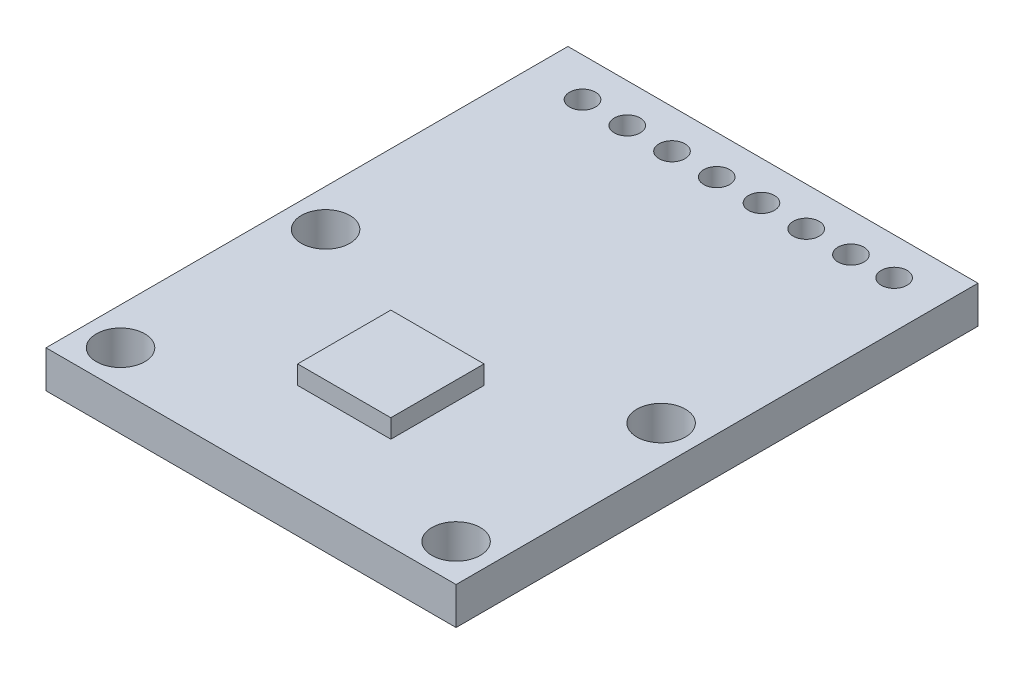
ISO-10303-21;
HEADER;
FILE_DESCRIPTION(('STEP AP214'),'2;1');
FILE_NAME('part.step','',(''),(''),'','','');
FILE_SCHEMA(('AUTOMOTIVE_DESIGN { 1 0 10303 214 1 1 1 1 }'));
ENDSEC;
DATA;
#1=APPLICATION_CONTEXT('core data for automotive mechanical design processes');
#2=APPLICATION_PROTOCOL_DEFINITION('international standard','automotive_design',2000,#1);
#3=PRODUCT_CONTEXT('',#1,'mechanical');
#4=PRODUCT('Part','Part','',(#3));
#5=PRODUCT_RELATED_PRODUCT_CATEGORY('part','',(#4));
#6=PRODUCT_DEFINITION_FORMATION('','',#4);
#7=PRODUCT_DEFINITION_CONTEXT('part definition',#1,'design');
#8=PRODUCT_DEFINITION('design','',#6,#7);
#9=PRODUCT_DEFINITION_SHAPE('','',#8);
#10=(LENGTH_UNIT() NAMED_UNIT(*) SI_UNIT(.MILLI.,.METRE.));
#11=(NAMED_UNIT(*) PLANE_ANGLE_UNIT() SI_UNIT($,.RADIAN.));
#12=(NAMED_UNIT(*) SI_UNIT($,.STERADIAN.) SOLID_ANGLE_UNIT());
#13=UNCERTAINTY_MEASURE_WITH_UNIT(LENGTH_MEASURE(1.E-05),#10,'distance_accuracy_value','');
#14=(GEOMETRIC_REPRESENTATION_CONTEXT(3) GLOBAL_UNCERTAINTY_ASSIGNED_CONTEXT((#13)) GLOBAL_UNIT_ASSIGNED_CONTEXT((#10,
#11,#12)) REPRESENTATION_CONTEXT('',''));
#15=CARTESIAN_POINT('',(0.,0.,0.));
#16=DIRECTION('',(0.,0.,1.));
#17=DIRECTION('',(1.,0.,0.));
#18=AXIS2_PLACEMENT_3D('',#15,#16,#17);
#19=CARTESIAN_POINT('',(0.,2.,0.));
#20=DIRECTION('',(0.,1.,0.));
#21=DIRECTION('',(0.,0.,1.));
#22=AXIS2_PLACEMENT_3D('',#19,#20,#21);
#23=PLANE('',#22);
#24=CARTESIAN_POINT('',(-8.13784102183297,2.,-11.9210073469347));
#25=DIRECTION('',(0.,1.,0.));
#26=DIRECTION('',(0.,0.,1.));
#27=AXIS2_PLACEMENT_3D('',#24,#25,#26);
#28=CIRCLE('',#27,0.695578212230315);
#29=CARTESIAN_POINT('',(-8.13784102183297,2.,-11.2254291347044));
#30=VERTEX_POINT('',#29);
#31=EDGE_CURVE('E408',#30,#30,#28,.T.);
#32=ORIENTED_EDGE('',*,*,#31,.F.);
#33=EDGE_LOOP('',(#32));
#34=FACE_BOUND('',#33,.T.);
#35=CARTESIAN_POINT('',(6.26215897816703,2.,-11.9210073469347));
#36=DIRECTION('',(0.,1.,0.));
#37=DIRECTION('',(0.,0.,1.));
#38=AXIS2_PLACEMENT_3D('',#35,#36,#37);
#39=CIRCLE('',#38,0.695578212230315);
#40=CARTESIAN_POINT('',(6.26215897816703,2.,-11.2254291347044));
#41=VERTEX_POINT('',#40);
#42=EDGE_CURVE('E432',#41,#41,#39,.T.);
#43=ORIENTED_EDGE('',*,*,#42,.F.);
#44=EDGE_LOOP('',(#43));
#45=FACE_BOUND('',#44,.T.);
#46=CARTESIAN_POINT('',(3.86215897816703,2.,-11.9210073469347));
#47=DIRECTION('',(0.,1.,0.));
#48=DIRECTION('',(0.,0.,1.));
#49=AXIS2_PLACEMENT_3D('',#46,#47,#48);
#50=CIRCLE('',#49,0.695578212230315);
#51=CARTESIAN_POINT('',(3.86215897816703,2.,-11.2254291347044));
#52=VERTEX_POINT('',#51);
#53=EDGE_CURVE('E426',#52,#52,#50,.T.);
#54=ORIENTED_EDGE('',*,*,#53,.F.);
#55=EDGE_LOOP('',(#54));
#56=FACE_BOUND('',#55,.T.);
#57=CARTESIAN_POINT('',(1.46215897816703,2.,-11.9210073469347));
#58=DIRECTION('',(0.,1.,0.));
#59=DIRECTION('',(0.,0.,1.));
#60=AXIS2_PLACEMENT_3D('',#57,#58,#59);
#61=CIRCLE('',#60,0.695578212230315);
#62=CARTESIAN_POINT('',(1.46215897816703,2.,-11.2254291347044));
#63=VERTEX_POINT('',#62);
#64=EDGE_CURVE('E420',#63,#63,#61,.T.);
#65=ORIENTED_EDGE('',*,*,#64,.F.);
#66=EDGE_LOOP('',(#65));
#67=FACE_BOUND('',#66,.T.);
#68=CARTESIAN_POINT('',(8.5,2.,-12.));
#69=DIRECTION('',(0.,1.,0.));
#70=DIRECTION('',(0.,0.,1.));
#71=AXIS2_PLACEMENT_3D('',#68,#69,#70);
#72=CIRCLE('',#71,0.695578212230315);
#73=CARTESIAN_POINT('',(8.5,2.,-11.3044217877697));
#74=VERTEX_POINT('',#73);
#75=EDGE_CURVE('E413',#74,#74,#72,.T.);
#76=ORIENTED_EDGE('',*,*,#75,.F.);
#77=EDGE_LOOP('',(#76));
#78=FACE_BOUND('',#77,.T.);
#79=CARTESIAN_POINT('',(-5.73784102183297,2.,-11.9210073469347));
#80=DIRECTION('',(0.,1.,0.));
#81=DIRECTION('',(0.,0.,1.));
#82=AXIS2_PLACEMENT_3D('',#79,#80,#81);
#83=CIRCLE('',#82,0.695578212230315);
#84=CARTESIAN_POINT('',(-5.73784102183297,2.,-11.2254291347044));
#85=VERTEX_POINT('',#84);
#86=EDGE_CURVE('E438',#85,#85,#83,.T.);
#87=ORIENTED_EDGE('',*,*,#86,.F.);
#88=EDGE_LOOP('',(#87));
#89=FACE_BOUND('',#88,.T.);
#90=CARTESIAN_POINT('',(-3.33784102183297,2.,-11.9210073469347));
#91=DIRECTION('',(0.,1.,0.));
#92=DIRECTION('',(0.,0.,1.));
#93=AXIS2_PLACEMENT_3D('',#90,#91,#92);
#94=CIRCLE('',#93,0.695578212230315);
#95=CARTESIAN_POINT('',(-3.33784102183297,2.,-11.2254291347044));
#96=VERTEX_POINT('',#95);
#97=EDGE_CURVE('E439',#96,#96,#94,.T.);
#98=ORIENTED_EDGE('',*,*,#97,.F.);
#99=EDGE_LOOP('',(#98));
#100=FACE_BOUND('',#99,.T.);
#101=CARTESIAN_POINT('',(-0.937841021832971,2.,-11.9210073469347));
#102=DIRECTION('',(0.,1.,0.));
#103=DIRECTION('',(0.,0.,1.));
#104=AXIS2_PLACEMENT_3D('',#101,#102,#103);
#105=CIRCLE('',#104,0.695578212230315);
#106=CARTESIAN_POINT('',(-0.937841021832971,2.,-11.2254291347044));
#107=VERTEX_POINT('',#106);
#108=EDGE_CURVE('E419',#107,#107,#105,.T.);
#109=ORIENTED_EDGE('',*,*,#108,.F.);
#110=EDGE_LOOP('',(#109));
#111=FACE_BOUND('',#110,.T.);
#112=CARTESIAN_POINT('',(9.,2.,0.999999999999996));
#113=DIRECTION('',(0.,1.,0.));
#114=DIRECTION('',(0.,0.,1.));
#115=AXIS2_PLACEMENT_3D('',#112,#113,#114);
#116=CIRCLE('',#115,1.3);
#117=CARTESIAN_POINT('',(9.,2.,2.3));
#118=VERTEX_POINT('',#117);
#119=EDGE_CURVE('E139',#118,#118,#116,.T.);
#120=ORIENTED_EDGE('',*,*,#119,.F.);
#121=EDGE_LOOP('',(#120));
#122=FACE_BOUND('',#121,.T.);
#123=CARTESIAN_POINT('',(-9.00000000000001,2.,0.999999999999998));
#124=DIRECTION('',(0.,1.,0.));
#125=DIRECTION('',(0.,0.,1.));
#126=AXIS2_PLACEMENT_3D('',#123,#124,#125);
#127=CIRCLE('',#126,1.3);
#128=CARTESIAN_POINT('',(-9.00000000000001,2.,2.3));
#129=VERTEX_POINT('',#128);
#130=EDGE_CURVE('E142',#129,#129,#127,.T.);
#131=ORIENTED_EDGE('',*,*,#130,.F.);
#132=EDGE_LOOP('',(#131));
#133=FACE_BOUND('',#132,.T.);
#134=CARTESIAN_POINT('',(-9.00000000000001,2.,12.));
#135=DIRECTION('',(0.,1.,0.));
#136=DIRECTION('',(0.,0.,1.));
#137=AXIS2_PLACEMENT_3D('',#134,#135,#136);
#138=CIRCLE('',#137,1.3);
#139=CARTESIAN_POINT('',(-9.00000000000001,2.,13.3));
#140=VERTEX_POINT('',#139);
#141=EDGE_CURVE('E146',#140,#140,#138,.T.);
#142=ORIENTED_EDGE('',*,*,#141,.F.);
#143=EDGE_LOOP('',(#142));
#144=FACE_BOUND('',#143,.T.);
#145=CARTESIAN_POINT('',(9.,2.,12.));
#146=DIRECTION('',(0.,1.,0.));
#147=DIRECTION('',(0.,0.,1.));
#148=AXIS2_PLACEMENT_3D('',#145,#146,#147);
#149=CIRCLE('',#148,1.3);
#150=CARTESIAN_POINT('',(9.,2.,13.3));
#151=VERTEX_POINT('',#150);
#152=EDGE_CURVE('E149',#151,#151,#149,.T.);
#153=ORIENTED_EDGE('',*,*,#152,.F.);
#154=EDGE_LOOP('',(#153));
#155=FACE_BOUND('',#154,.T.);
#156=DIRECTION('',(1.,0.,0.));
#157=VECTOR('',#156,1.);
#158=CARTESIAN_POINT('',(0.,2.,14.));
#159=LINE('',#158,#157);
#160=CARTESIAN_POINT('',(-11.,2.,14.));
#161=VERTEX_POINT('',#160);
#162=CARTESIAN_POINT('',(11.,2.,14.));
#163=VERTEX_POINT('',#162);
#164=EDGE_CURVE('E152',#161,#163,#159,.T.);
#165=ORIENTED_EDGE('',*,*,#164,.T.);
#166=DIRECTION('',(0.,0.,-1.));
#167=VECTOR('',#166,1.);
#168=CARTESIAN_POINT('',(11.,2.,0.));
#169=LINE('',#168,#167);
#170=CARTESIAN_POINT('',(11.,2.,-14.));
#171=VERTEX_POINT('',#170);
#172=EDGE_CURVE('E83',#163,#171,#169,.T.);
#173=ORIENTED_EDGE('',*,*,#172,.T.);
#174=DIRECTION('',(1.,0.,0.));
#175=VECTOR('',#174,1.);
#176=CARTESIAN_POINT('',(0.,2.,-14.));
#177=LINE('',#176,#175);
#178=CARTESIAN_POINT('',(-11.,2.,-14.));
#179=VERTEX_POINT('',#178);
#180=EDGE_CURVE('E155',#179,#171,#177,.T.);
#181=ORIENTED_EDGE('',*,*,#180,.F.);
#182=DIRECTION('',(0.,0.,-1.));
#183=VECTOR('',#182,1.);
#184=CARTESIAN_POINT('',(-11.,2.,0.));
#185=LINE('',#184,#183);
#186=EDGE_CURVE('E158',#161,#179,#185,.T.);
#187=ORIENTED_EDGE('',*,*,#186,.F.);
#188=EDGE_LOOP('',(#165,#173,#181,#187));
#189=FACE_BOUND('',#188,.T.);
#190=DIRECTION('',(-1.,0.,0.));
#191=VECTOR('',#190,1.);
#192=CARTESIAN_POINT('',(-2.5,2.,4.));
#193=LINE('',#192,#191);
#194=CARTESIAN_POINT('',(2.5,2.,4.));
#195=VERTEX_POINT('',#194);
#196=CARTESIAN_POINT('',(-2.5,2.,4.));
#197=VERTEX_POINT('',#196);
#198=EDGE_CURVE('E458',#195,#197,#193,.T.);
#199=ORIENTED_EDGE('',*,*,#198,.F.);
#200=DIRECTION('',(0.,0.,-1.));
#201=VECTOR('',#200,1.);
#202=CARTESIAN_POINT('',(2.5,2.,9.));
#203=LINE('',#202,#201);
#204=CARTESIAN_POINT('',(2.5,2.,9.));
#205=VERTEX_POINT('',#204);
#206=EDGE_CURVE('E129',#205,#195,#203,.T.);
#207=ORIENTED_EDGE('',*,*,#206,.F.);
#208=DIRECTION('',(1.,0.,0.));
#209=VECTOR('',#208,1.);
#210=CARTESIAN_POINT('',(-2.5,2.,9.));
#211=LINE('',#210,#209);
#212=CARTESIAN_POINT('',(-2.5,2.,9.));
#213=VERTEX_POINT('',#212);
#214=EDGE_CURVE('E125',#213,#205,#211,.T.);
#215=ORIENTED_EDGE('',*,*,#214,.F.);
#216=DIRECTION('',(0.,0.,1.));
#217=VECTOR('',#216,1.);
#218=CARTESIAN_POINT('',(-2.5,2.,9.));
#219=LINE('',#218,#217);
#220=EDGE_CURVE('E460',#197,#213,#219,.T.);
#221=ORIENTED_EDGE('',*,*,#220,.F.);
#222=EDGE_LOOP('',(#199,#207,#215,#221));
#223=FACE_BOUND('',#222,.T.);
#224=ADVANCED_FACE('F33',(#34,#45,#56,#67,#78,#89,#100,#111,#122,#133,#144,#155,#189,#223),#23,.T.);
#225=CARTESIAN_POINT('',(0.,2.,14.));
#226=DIRECTION('',(0.,0.,-1.));
#227=DIRECTION('',(-1.,0.,0.));
#228=AXIS2_PLACEMENT_3D('',#225,#226,#227);
#229=PLANE('',#228);
#230=DIRECTION('',(1.,0.,0.));
#231=VECTOR('',#230,1.);
#232=CARTESIAN_POINT('',(0.,0.,14.));
#233=LINE('',#232,#231);
#234=CARTESIAN_POINT('',(-11.,0.,14.));
#235=VERTEX_POINT('',#234);
#236=CARTESIAN_POINT('',(11.,0.,14.));
#237=VERTEX_POINT('',#236);
#238=EDGE_CURVE('E168',#235,#237,#233,.T.);
#239=ORIENTED_EDGE('',*,*,#238,.T.);
#240=DIRECTION('',(0.,-1.,0.));
#241=VECTOR('',#240,1.);
#242=CARTESIAN_POINT('',(11.,2.,14.));
#243=LINE('',#242,#241);
#244=EDGE_CURVE('E11',#163,#237,#243,.T.);
#245=ORIENTED_EDGE('',*,*,#244,.F.);
#246=ORIENTED_EDGE('',*,*,#164,.F.);
#247=DIRECTION('',(0.,-1.,0.));
#248=VECTOR('',#247,1.);
#249=CARTESIAN_POINT('',(-11.,2.,14.));
#250=LINE('',#249,#248);
#251=EDGE_CURVE('E57',#161,#235,#250,.T.);
#252=ORIENTED_EDGE('',*,*,#251,.T.);
#253=EDGE_LOOP('',(#239,#245,#246,#252));
#254=FACE_BOUND('',#253,.T.);
#255=ADVANCED_FACE('F192',(#254),#229,.F.);
#256=CARTESIAN_POINT('',(11.,2.,0.));
#257=DIRECTION('',(-1.,0.,0.));
#258=DIRECTION('',(0.,0.,1.));
#259=AXIS2_PLACEMENT_3D('',#256,#257,#258);
#260=PLANE('',#259);
#261=DIRECTION('',(0.,0.,-1.));
#262=VECTOR('',#261,1.);
#263=CARTESIAN_POINT('',(11.,0.,0.));
#264=LINE('',#263,#262);
#265=CARTESIAN_POINT('',(11.,0.,-14.));
#266=VERTEX_POINT('',#265);
#267=EDGE_CURVE('E170',#237,#266,#264,.T.);
#268=ORIENTED_EDGE('',*,*,#267,.T.);
#269=DIRECTION('',(0.,-1.,0.));
#270=VECTOR('',#269,1.);
#271=CARTESIAN_POINT('',(11.,2.,-14.));
#272=LINE('',#271,#270);
#273=EDGE_CURVE('E41',#171,#266,#272,.T.);
#274=ORIENTED_EDGE('',*,*,#273,.F.);
#275=ORIENTED_EDGE('',*,*,#172,.F.);
#276=ORIENTED_EDGE('',*,*,#244,.T.);
#277=EDGE_LOOP('',(#268,#274,#275,#276));
#278=FACE_BOUND('',#277,.T.);
#279=ADVANCED_FACE('F184',(#278),#260,.F.);
#280=CARTESIAN_POINT('',(0.,2.,-14.));
#281=DIRECTION('',(0.,0.,-1.));
#282=DIRECTION('',(-1.,0.,0.));
#283=AXIS2_PLACEMENT_3D('',#280,#281,#282);
#284=PLANE('',#283);
#285=DIRECTION('',(1.,0.,0.));
#286=VECTOR('',#285,1.);
#287=CARTESIAN_POINT('',(0.,0.,-14.));
#288=LINE('',#287,#286);
#289=CARTESIAN_POINT('',(-11.,0.,-14.));
#290=VERTEX_POINT('',#289);
#291=EDGE_CURVE('E173',#290,#266,#288,.T.);
#292=ORIENTED_EDGE('',*,*,#291,.F.);
#293=DIRECTION('',(0.,-1.,0.));
#294=VECTOR('',#293,1.);
#295=CARTESIAN_POINT('',(-11.,2.,-14.));
#296=LINE('',#295,#294);
#297=EDGE_CURVE('E179',#179,#290,#296,.T.);
#298=ORIENTED_EDGE('',*,*,#297,.F.);
#299=ORIENTED_EDGE('',*,*,#180,.T.);
#300=ORIENTED_EDGE('',*,*,#273,.T.);
#301=EDGE_LOOP('',(#292,#298,#299,#300));
#302=FACE_BOUND('',#301,.T.);
#303=ADVANCED_FACE('F182',(#302),#284,.T.);
#304=CARTESIAN_POINT('',(9.,2.,12.));
#305=DIRECTION('',(0.,-1.,0.));
#306=DIRECTION('',(0.,0.,-1.));
#307=AXIS2_PLACEMENT_3D('',#304,#305,#306);
#308=CYLINDRICAL_SURFACE('',#307,1.3);
#309=ORIENTED_EDGE('',*,*,#152,.T.);
#310=EDGE_LOOP('',(#309));
#311=FACE_BOUND('',#310,.T.);
#312=CARTESIAN_POINT('',(9.,0.,12.));
#313=DIRECTION('',(0.,1.,0.));
#314=DIRECTION('',(0.,0.,1.));
#315=AXIS2_PLACEMENT_3D('',#312,#313,#314);
#316=CIRCLE('',#315,1.3);
#317=CARTESIAN_POINT('',(9.,0.,13.3));
#318=VERTEX_POINT('',#317);
#319=EDGE_CURVE('E165',#318,#318,#316,.T.);
#320=ORIENTED_EDGE('',*,*,#319,.F.);
#321=EDGE_LOOP('',(#320));
#322=FACE_BOUND('',#321,.T.);
#323=ADVANCED_FACE('F204',(#311,#322),#308,.F.);
#324=CARTESIAN_POINT('',(-9.00000000000001,2.,12.));
#325=DIRECTION('',(0.,-1.,0.));
#326=DIRECTION('',(0.,0.,-1.));
#327=AXIS2_PLACEMENT_3D('',#324,#325,#326);
#328=CYLINDRICAL_SURFACE('',#327,1.3);
#329=ORIENTED_EDGE('',*,*,#141,.T.);
#330=EDGE_LOOP('',(#329));
#331=FACE_BOUND('',#330,.T.);
#332=CARTESIAN_POINT('',(-9.00000000000001,0.,12.));
#333=DIRECTION('',(0.,1.,0.));
#334=DIRECTION('',(0.,0.,1.));
#335=AXIS2_PLACEMENT_3D('',#332,#333,#334);
#336=CIRCLE('',#335,1.3);
#337=CARTESIAN_POINT('',(-9.00000000000001,0.,13.3));
#338=VERTEX_POINT('',#337);
#339=EDGE_CURVE('E162',#338,#338,#336,.T.);
#340=ORIENTED_EDGE('',*,*,#339,.F.);
#341=EDGE_LOOP('',(#340));
#342=FACE_BOUND('',#341,.T.);
#343=ADVANCED_FACE('F207',(#331,#342),#328,.F.);
#344=CARTESIAN_POINT('',(-9.00000000000001,2.,0.999999999999998));
#345=DIRECTION('',(0.,-1.,0.));
#346=DIRECTION('',(0.,0.,-1.));
#347=AXIS2_PLACEMENT_3D('',#344,#345,#346);
#348=CYLINDRICAL_SURFACE('',#347,1.3);
#349=ORIENTED_EDGE('',*,*,#130,.T.);
#350=EDGE_LOOP('',(#349));
#351=FACE_BOUND('',#350,.T.);
#352=CARTESIAN_POINT('',(-9.00000000000001,0.,0.999999999999998));
#353=DIRECTION('',(0.,1.,0.));
#354=DIRECTION('',(0.,0.,1.));
#355=AXIS2_PLACEMENT_3D('',#352,#353,#354);
#356=CIRCLE('',#355,1.3);
#357=CARTESIAN_POINT('',(-9.00000000000001,0.,2.3));
#358=VERTEX_POINT('',#357);
#359=EDGE_CURVE('E134',#358,#358,#356,.T.);
#360=ORIENTED_EDGE('',*,*,#359,.F.);
#361=EDGE_LOOP('',(#360));
#362=FACE_BOUND('',#361,.T.);
#363=ADVANCED_FACE('F210',(#351,#362),#348,.F.);
#364=CARTESIAN_POINT('',(9.,2.,0.999999999999996));
#365=DIRECTION('',(0.,-1.,0.));
#366=DIRECTION('',(0.,0.,-1.));
#367=AXIS2_PLACEMENT_3D('',#364,#365,#366);
#368=CYLINDRICAL_SURFACE('',#367,1.3);
#369=ORIENTED_EDGE('',*,*,#119,.T.);
#370=EDGE_LOOP('',(#369));
#371=FACE_BOUND('',#370,.T.);
#372=CARTESIAN_POINT('',(9.,0.,0.999999999999996));
#373=DIRECTION('',(0.,1.,0.));
#374=DIRECTION('',(0.,0.,1.));
#375=AXIS2_PLACEMENT_3D('',#372,#373,#374);
#376=CIRCLE('',#375,1.3);
#377=CARTESIAN_POINT('',(9.,0.,2.3));
#378=VERTEX_POINT('',#377);
#379=EDGE_CURVE('E131',#378,#378,#376,.T.);
#380=ORIENTED_EDGE('',*,*,#379,.F.);
#381=EDGE_LOOP('',(#380));
#382=FACE_BOUND('',#381,.T.);
#383=ADVANCED_FACE('F35',(#371,#382),#368,.F.);
#384=CARTESIAN_POINT('',(-11.,2.,0.));
#385=DIRECTION('',(-1.,0.,0.));
#386=DIRECTION('',(0.,0.,1.));
#387=AXIS2_PLACEMENT_3D('',#384,#385,#386);
#388=PLANE('',#387);
#389=DIRECTION('',(0.,0.,-1.));
#390=VECTOR('',#389,1.);
#391=CARTESIAN_POINT('',(-11.,0.,0.));
#392=LINE('',#391,#390);
#393=EDGE_CURVE('E143',#235,#290,#392,.T.);
#394=ORIENTED_EDGE('',*,*,#393,.F.);
#395=ORIENTED_EDGE('',*,*,#251,.F.);
#396=ORIENTED_EDGE('',*,*,#186,.T.);
#397=ORIENTED_EDGE('',*,*,#297,.T.);
#398=EDGE_LOOP('',(#394,#395,#396,#397));
#399=FACE_BOUND('',#398,.T.);
#400=ADVANCED_FACE('F188',(#399),#388,.T.);
#401=CARTESIAN_POINT('',(0.,0.,0.));
#402=DIRECTION('',(0.,1.,0.));
#403=DIRECTION('',(0.,0.,1.));
#404=AXIS2_PLACEMENT_3D('',#401,#402,#403);
#405=PLANE('',#404);
#406=CARTESIAN_POINT('',(-8.13784102183297,0.,-11.9210073469347));
#407=DIRECTION('',(0.,1.,0.));
#408=DIRECTION('',(0.,0.,1.));
#409=AXIS2_PLACEMENT_3D('',#406,#407,#408);
#410=CIRCLE('',#409,0.695578212230315);
#411=CARTESIAN_POINT('',(-8.13784102183297,0.,-11.2254291347044));
#412=VERTEX_POINT('',#411);
#413=EDGE_CURVE('E405',#412,#412,#410,.T.);
#414=ORIENTED_EDGE('',*,*,#413,.T.);
#415=EDGE_LOOP('',(#414));
#416=FACE_BOUND('',#415,.T.);
#417=CARTESIAN_POINT('',(6.26215897816703,0.,-11.9210073469347));
#418=DIRECTION('',(0.,1.,0.));
#419=DIRECTION('',(0.,0.,1.));
#420=AXIS2_PLACEMENT_3D('',#417,#418,#419);
#421=CIRCLE('',#420,0.695578212230315);
#422=CARTESIAN_POINT('',(6.26215897816703,0.,-11.2254291347044));
#423=VERTEX_POINT('',#422);
#424=EDGE_CURVE('E429',#423,#423,#421,.T.);
#425=ORIENTED_EDGE('',*,*,#424,.T.);
#426=EDGE_LOOP('',(#425));
#427=FACE_BOUND('',#426,.T.);
#428=CARTESIAN_POINT('',(3.86215897816703,0.,-11.9210073469347));
#429=DIRECTION('',(0.,1.,0.));
#430=DIRECTION('',(0.,0.,1.));
#431=AXIS2_PLACEMENT_3D('',#428,#429,#430);
#432=CIRCLE('',#431,0.695578212230315);
#433=CARTESIAN_POINT('',(3.86215897816703,0.,-11.2254291347044));
#434=VERTEX_POINT('',#433);
#435=EDGE_CURVE('E423',#434,#434,#432,.T.);
#436=ORIENTED_EDGE('',*,*,#435,.T.);
#437=EDGE_LOOP('',(#436));
#438=FACE_BOUND('',#437,.T.);
#439=CARTESIAN_POINT('',(1.46215897816703,0.,-11.9210073469347));
#440=DIRECTION('',(0.,1.,0.));
#441=DIRECTION('',(0.,0.,1.));
#442=AXIS2_PLACEMENT_3D('',#439,#440,#441);
#443=CIRCLE('',#442,0.695578212230315);
#444=CARTESIAN_POINT('',(1.46215897816703,0.,-11.2254291347044));
#445=VERTEX_POINT('',#444);
#446=EDGE_CURVE('E416',#445,#445,#443,.T.);
#447=ORIENTED_EDGE('',*,*,#446,.T.);
#448=EDGE_LOOP('',(#447));
#449=FACE_BOUND('',#448,.T.);
#450=CARTESIAN_POINT('',(8.5,0.,-12.));
#451=DIRECTION('',(0.,1.,0.));
#452=DIRECTION('',(0.,0.,1.));
#453=AXIS2_PLACEMENT_3D('',#450,#451,#452);
#454=CIRCLE('',#453,0.695578212230315);
#455=CARTESIAN_POINT('',(8.5,0.,-11.3044217877697));
#456=VERTEX_POINT('',#455);
#457=EDGE_CURVE('E409',#456,#456,#454,.T.);
#458=ORIENTED_EDGE('',*,*,#457,.T.);
#459=EDGE_LOOP('',(#458));
#460=FACE_BOUND('',#459,.T.);
#461=CARTESIAN_POINT('',(-5.73784102183297,0.,-11.9210073469347));
#462=DIRECTION('',(0.,1.,0.));
#463=DIRECTION('',(0.,0.,1.));
#464=AXIS2_PLACEMENT_3D('',#461,#462,#463);
#465=CIRCLE('',#464,0.695578212230315);
#466=CARTESIAN_POINT('',(-5.73784102183297,0.,-11.2254291347044));
#467=VERTEX_POINT('',#466);
#468=EDGE_CURVE('E449',#467,#467,#465,.T.);
#469=ORIENTED_EDGE('',*,*,#468,.T.);
#470=EDGE_LOOP('',(#469));
#471=FACE_BOUND('',#470,.T.);
#472=CARTESIAN_POINT('',(-3.33784102183297,0.,-11.9210073469347));
#473=DIRECTION('',(0.,1.,0.));
#474=DIRECTION('',(0.,0.,1.));
#475=AXIS2_PLACEMENT_3D('',#472,#473,#474);
#476=CIRCLE('',#475,0.695578212230315);
#477=CARTESIAN_POINT('',(-3.33784102183297,0.,-11.2254291347044));
#478=VERTEX_POINT('',#477);
#479=EDGE_CURVE('E435',#478,#478,#476,.T.);
#480=ORIENTED_EDGE('',*,*,#479,.T.);
#481=EDGE_LOOP('',(#480));
#482=FACE_BOUND('',#481,.T.);
#483=CARTESIAN_POINT('',(-0.937841021832971,0.,-11.9210073469347));
#484=DIRECTION('',(0.,1.,0.));
#485=DIRECTION('',(0.,0.,1.));
#486=AXIS2_PLACEMENT_3D('',#483,#484,#485);
#487=CIRCLE('',#486,0.695578212230315);
#488=CARTESIAN_POINT('',(-0.937841021832971,0.,-11.2254291347044));
#489=VERTEX_POINT('',#488);
#490=EDGE_CURVE('E442',#489,#489,#487,.T.);
#491=ORIENTED_EDGE('',*,*,#490,.T.);
#492=EDGE_LOOP('',(#491));
#493=FACE_BOUND('',#492,.T.);
#494=ORIENTED_EDGE('',*,*,#379,.T.);
#495=EDGE_LOOP('',(#494));
#496=FACE_BOUND('',#495,.T.);
#497=ORIENTED_EDGE('',*,*,#359,.T.);
#498=EDGE_LOOP('',(#497));
#499=FACE_BOUND('',#498,.T.);
#500=ORIENTED_EDGE('',*,*,#339,.T.);
#501=EDGE_LOOP('',(#500));
#502=FACE_BOUND('',#501,.T.);
#503=ORIENTED_EDGE('',*,*,#319,.T.);
#504=EDGE_LOOP('',(#503));
#505=FACE_BOUND('',#504,.T.);
#506=ORIENTED_EDGE('',*,*,#238,.F.);
#507=ORIENTED_EDGE('',*,*,#393,.T.);
#508=ORIENTED_EDGE('',*,*,#291,.T.);
#509=ORIENTED_EDGE('',*,*,#267,.F.);
#510=EDGE_LOOP('',(#506,#507,#508,#509));
#511=FACE_BOUND('',#510,.T.);
#512=ADVANCED_FACE('F187',(#416,#427,#438,#449,#460,#471,#482,#493,#496,#499,#502,#505,#511),
#405,.F.);
#513=CARTESIAN_POINT('',(2.5,3.,9.));
#514=DIRECTION('',(-1.,0.,0.));
#515=DIRECTION('',(0.,0.,1.));
#516=AXIS2_PLACEMENT_3D('',#513,#514,#515);
#517=PLANE('',#516);
#518=ORIENTED_EDGE('',*,*,#206,.T.);
#519=DIRECTION('',(0.,-1.,0.));
#520=VECTOR('',#519,1.);
#521=CARTESIAN_POINT('',(2.5,3.,4.));
#522=LINE('',#521,#520);
#523=CARTESIAN_POINT('',(2.5,3.,4.));
#524=VERTEX_POINT('',#523);
#525=EDGE_CURVE('E110',#524,#195,#522,.T.);
#526=ORIENTED_EDGE('',*,*,#525,.F.);
#527=DIRECTION('',(0.,0.,-1.));
#528=VECTOR('',#527,1.);
#529=CARTESIAN_POINT('',(2.5,3.,9.));
#530=LINE('',#529,#528);
#531=CARTESIAN_POINT('',(2.5,3.,9.));
#532=VERTEX_POINT('',#531);
#533=EDGE_CURVE('E117',#532,#524,#530,.T.);
#534=ORIENTED_EDGE('',*,*,#533,.F.);
#535=DIRECTION('',(0.,-1.,0.));
#536=VECTOR('',#535,1.);
#537=CARTESIAN_POINT('',(2.5,3.,9.));
#538=LINE('',#537,#536);
#539=EDGE_CURVE('E456',#532,#205,#538,.T.);
#540=ORIENTED_EDGE('',*,*,#539,.T.);
#541=EDGE_LOOP('',(#518,#526,#534,#540));
#542=FACE_BOUND('',#541,.T.);
#543=ADVANCED_FACE('F127',(#542),#517,.F.);
#544=CARTESIAN_POINT('',(-2.5,3.,4.));
#545=DIRECTION('',(0.,0.,1.));
#546=DIRECTION('',(1.,0.,0.));
#547=AXIS2_PLACEMENT_3D('',#544,#545,#546);
#548=PLANE('',#547);
#549=ORIENTED_EDGE('',*,*,#198,.T.);
#550=DIRECTION('',(0.,-1.,0.));
#551=VECTOR('',#550,1.);
#552=CARTESIAN_POINT('',(-2.5,3.,4.));
#553=LINE('',#552,#551);
#554=CARTESIAN_POINT('',(-2.5,3.,4.));
#555=VERTEX_POINT('',#554);
#556=EDGE_CURVE('E113',#555,#197,#553,.T.);
#557=ORIENTED_EDGE('',*,*,#556,.F.);
#558=DIRECTION('',(-1.,0.,0.));
#559=VECTOR('',#558,1.);
#560=CARTESIAN_POINT('',(-2.5,3.,4.));
#561=LINE('',#560,#559);
#562=EDGE_CURVE('E106',#524,#555,#561,.T.);
#563=ORIENTED_EDGE('',*,*,#562,.F.);
#564=ORIENTED_EDGE('',*,*,#525,.T.);
#565=EDGE_LOOP('',(#549,#557,#563,#564));
#566=FACE_BOUND('',#565,.T.);
#567=ADVANCED_FACE('F108',(#566),#548,.F.);
#568=CARTESIAN_POINT('',(-2.5,3.,9.));
#569=DIRECTION('',(1.,0.,0.));
#570=DIRECTION('',(0.,0.,-1.));
#571=AXIS2_PLACEMENT_3D('',#568,#569,#570);
#572=PLANE('',#571);
#573=ORIENTED_EDGE('',*,*,#220,.T.);
#574=DIRECTION('',(0.,-1.,0.));
#575=VECTOR('',#574,1.);
#576=CARTESIAN_POINT('',(-2.5,3.,9.));
#577=LINE('',#576,#575);
#578=CARTESIAN_POINT('',(-2.5,3.,9.));
#579=VERTEX_POINT('',#578);
#580=EDGE_CURVE('E48',#579,#213,#577,.T.);
#581=ORIENTED_EDGE('',*,*,#580,.F.);
#582=DIRECTION('',(0.,0.,1.));
#583=VECTOR('',#582,1.);
#584=CARTESIAN_POINT('',(-2.5,3.,9.));
#585=LINE('',#584,#583);
#586=EDGE_CURVE('E116',#555,#579,#585,.T.);
#587=ORIENTED_EDGE('',*,*,#586,.F.);
#588=ORIENTED_EDGE('',*,*,#556,.T.);
#589=EDGE_LOOP('',(#573,#581,#587,#588));
#590=FACE_BOUND('',#589,.T.);
#591=ADVANCED_FACE('F285',(#590),#572,.F.);
#592=CARTESIAN_POINT('',(-2.5,3.,9.));
#593=DIRECTION('',(0.,0.,-1.));
#594=DIRECTION('',(-1.,0.,0.));
#595=AXIS2_PLACEMENT_3D('',#592,#593,#594);
#596=PLANE('',#595);
#597=ORIENTED_EDGE('',*,*,#214,.T.);
#598=ORIENTED_EDGE('',*,*,#539,.F.);
#599=DIRECTION('',(1.,0.,0.));
#600=VECTOR('',#599,1.);
#601=CARTESIAN_POINT('',(-2.5,3.,9.));
#602=LINE('',#601,#600);
#603=EDGE_CURVE('E121',#579,#532,#602,.T.);
#604=ORIENTED_EDGE('',*,*,#603,.F.);
#605=ORIENTED_EDGE('',*,*,#580,.T.);
#606=EDGE_LOOP('',(#597,#598,#604,#605));
#607=FACE_BOUND('',#606,.T.);
#608=ADVANCED_FACE('F294',(#607),#596,.F.);
#609=CARTESIAN_POINT('',(0.,3.,0.));
#610=DIRECTION('',(0.,-1.,0.));
#611=DIRECTION('',(0.,0.,-1.));
#612=AXIS2_PLACEMENT_3D('',#609,#610,#611);
#613=PLANE('',#612);
#614=ORIENTED_EDGE('',*,*,#533,.T.);
#615=ORIENTED_EDGE('',*,*,#562,.T.);
#616=ORIENTED_EDGE('',*,*,#586,.T.);
#617=ORIENTED_EDGE('',*,*,#603,.T.);
#618=EDGE_LOOP('',(#614,#615,#616,#617));
#619=FACE_BOUND('',#618,.T.);
#620=ADVANCED_FACE('F120',(#619),#613,.F.);
#621=CARTESIAN_POINT('',(-0.937841021832971,0.,-11.9210073469347));
#622=DIRECTION('',(0.,1.,0.));
#623=DIRECTION('',(0.,0.,1.));
#624=AXIS2_PLACEMENT_3D('',#621,#622,#623);
#625=CYLINDRICAL_SURFACE('',#624,0.695578212230315);
#626=ORIENTED_EDGE('',*,*,#490,.F.);
#627=EDGE_LOOP('',(#626));
#628=FACE_BOUND('',#627,.T.);
#629=ORIENTED_EDGE('',*,*,#108,.T.);
#630=EDGE_LOOP('',(#629));
#631=FACE_BOUND('',#630,.T.);
#632=ADVANCED_FACE('F312',(#628,#631),#625,.F.);
#633=CARTESIAN_POINT('',(-3.33784102183297,0.,-11.9210073469347));
#634=DIRECTION('',(0.,1.,0.));
#635=DIRECTION('',(0.,0.,1.));
#636=AXIS2_PLACEMENT_3D('',#633,#634,#635);
#637=CYLINDRICAL_SURFACE('',#636,0.695578212230315);
#638=ORIENTED_EDGE('',*,*,#479,.F.);
#639=EDGE_LOOP('',(#638));
#640=FACE_BOUND('',#639,.T.);
#641=ORIENTED_EDGE('',*,*,#97,.T.);
#642=EDGE_LOOP('',(#641));
#643=FACE_BOUND('',#642,.T.);
#644=ADVANCED_FACE('F329',(#640,#643),#637,.F.);
#645=CARTESIAN_POINT('',(-5.73784102183297,0.,-11.9210073469347));
#646=DIRECTION('',(0.,1.,0.));
#647=DIRECTION('',(0.,0.,1.));
#648=AXIS2_PLACEMENT_3D('',#645,#646,#647);
#649=CYLINDRICAL_SURFACE('',#648,0.695578212230315);
#650=ORIENTED_EDGE('',*,*,#468,.F.);
#651=EDGE_LOOP('',(#650));
#652=FACE_BOUND('',#651,.T.);
#653=ORIENTED_EDGE('',*,*,#86,.T.);
#654=EDGE_LOOP('',(#653));
#655=FACE_BOUND('',#654,.T.);
#656=ADVANCED_FACE('F339',(#652,#655),#649,.F.);
#657=CARTESIAN_POINT('',(8.5,0.,-12.));
#658=DIRECTION('',(0.,1.,0.));
#659=DIRECTION('',(0.,0.,1.));
#660=AXIS2_PLACEMENT_3D('',#657,#658,#659);
#661=CYLINDRICAL_SURFACE('',#660,0.695578212230315);
#662=ORIENTED_EDGE('',*,*,#457,.F.);
#663=EDGE_LOOP('',(#662));
#664=FACE_BOUND('',#663,.T.);
#665=ORIENTED_EDGE('',*,*,#75,.T.);
#666=EDGE_LOOP('',(#665));
#667=FACE_BOUND('',#666,.T.);
#668=ADVANCED_FACE('F349',(#664,#667),#661,.F.);
#669=CARTESIAN_POINT('',(1.46215897816703,0.,-11.9210073469347));
#670=DIRECTION('',(0.,1.,0.));
#671=DIRECTION('',(0.,0.,1.));
#672=AXIS2_PLACEMENT_3D('',#669,#670,#671);
#673=CYLINDRICAL_SURFACE('',#672,0.695578212230315);
#674=ORIENTED_EDGE('',*,*,#446,.F.);
#675=EDGE_LOOP('',(#674));
#676=FACE_BOUND('',#675,.T.);
#677=ORIENTED_EDGE('',*,*,#64,.T.);
#678=EDGE_LOOP('',(#677));
#679=FACE_BOUND('',#678,.T.);
#680=ADVANCED_FACE('F359',(#676,#679),#673,.F.);
#681=CARTESIAN_POINT('',(3.86215897816703,0.,-11.9210073469347));
#682=DIRECTION('',(0.,1.,0.));
#683=DIRECTION('',(0.,0.,1.));
#684=AXIS2_PLACEMENT_3D('',#681,#682,#683);
#685=CYLINDRICAL_SURFACE('',#684,0.695578212230315);
#686=ORIENTED_EDGE('',*,*,#435,.F.);
#687=EDGE_LOOP('',(#686));
#688=FACE_BOUND('',#687,.T.);
#689=ORIENTED_EDGE('',*,*,#53,.T.);
#690=EDGE_LOOP('',(#689));
#691=FACE_BOUND('',#690,.T.);
#692=ADVANCED_FACE('F369',(#688,#691),#685,.F.);
#693=CARTESIAN_POINT('',(6.26215897816703,0.,-11.9210073469347));
#694=DIRECTION('',(0.,1.,0.));
#695=DIRECTION('',(0.,0.,1.));
#696=AXIS2_PLACEMENT_3D('',#693,#694,#695);
#697=CYLINDRICAL_SURFACE('',#696,0.695578212230315);
#698=ORIENTED_EDGE('',*,*,#424,.F.);
#699=EDGE_LOOP('',(#698));
#700=FACE_BOUND('',#699,.T.);
#701=ORIENTED_EDGE('',*,*,#42,.T.);
#702=EDGE_LOOP('',(#701));
#703=FACE_BOUND('',#702,.T.);
#704=ADVANCED_FACE('F379',(#700,#703),#697,.F.);
#705=CARTESIAN_POINT('',(-8.13784102183297,0.,-11.9210073469347));
#706=DIRECTION('',(0.,1.,0.));
#707=DIRECTION('',(0.,0.,1.));
#708=AXIS2_PLACEMENT_3D('',#705,#706,#707);
#709=CYLINDRICAL_SURFACE('',#708,0.695578212230315);
#710=ORIENTED_EDGE('',*,*,#413,.F.);
#711=EDGE_LOOP('',(#710));
#712=FACE_BOUND('',#711,.T.);
#713=ORIENTED_EDGE('',*,*,#31,.T.);
#714=EDGE_LOOP('',(#713));
#715=FACE_BOUND('',#714,.T.);
#716=ADVANCED_FACE('F389',(#712,#715),#709,.F.);
#717=CLOSED_SHELL('',(#224,#255,#279,#303,#323,#343,#363,#383,#400,#512,#543,#567,#591,#608,
#620,#632,#644,#656,#668,#680,#692,#704,#716));
#718=MANIFOLD_SOLID_BREP('B2',#717);
#719=ADVANCED_BREP_SHAPE_REPRESENTATION('',(#18,#718),#14);
#720=SHAPE_DEFINITION_REPRESENTATION(#9,#719);
ENDSEC;
END-ISO-10303-21;
